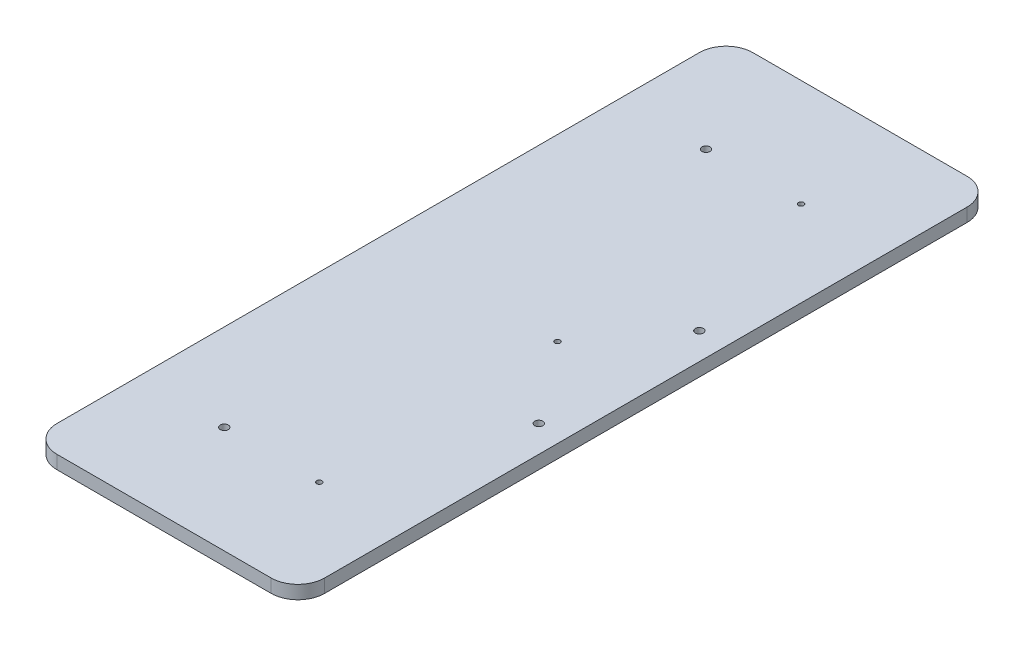
ISO-10303-21;
HEADER;
FILE_DESCRIPTION(('STEP AP214'),'2;1');
FILE_NAME('part.step','',(''),(''),'','','');
FILE_SCHEMA(('AUTOMOTIVE_DESIGN { 1 0 10303 214 1 1 1 1 }'));
ENDSEC;
DATA;
#1=APPLICATION_CONTEXT('core data for automotive mechanical design processes');
#2=APPLICATION_PROTOCOL_DEFINITION('international standard','automotive_design',2000,#1);
#3=PRODUCT_CONTEXT('',#1,'mechanical');
#4=PRODUCT('Part','Part','',(#3));
#5=PRODUCT_RELATED_PRODUCT_CATEGORY('part','',(#4));
#6=PRODUCT_DEFINITION_FORMATION('','',#4);
#7=PRODUCT_DEFINITION_CONTEXT('part definition',#1,'design');
#8=PRODUCT_DEFINITION('design','',#6,#7);
#9=PRODUCT_DEFINITION_SHAPE('','',#8);
#10=(LENGTH_UNIT() NAMED_UNIT(*) SI_UNIT(.MILLI.,.METRE.));
#11=(NAMED_UNIT(*) PLANE_ANGLE_UNIT() SI_UNIT($,.RADIAN.));
#12=(NAMED_UNIT(*) SI_UNIT($,.STERADIAN.) SOLID_ANGLE_UNIT());
#13=UNCERTAINTY_MEASURE_WITH_UNIT(LENGTH_MEASURE(1.E-05),#10,'distance_accuracy_value','');
#14=(GEOMETRIC_REPRESENTATION_CONTEXT(3) GLOBAL_UNCERTAINTY_ASSIGNED_CONTEXT((#13)) GLOBAL_UNIT_ASSIGNED_CONTEXT((#10,
#11,#12)) REPRESENTATION_CONTEXT('',''));
#15=CARTESIAN_POINT('',(0.,0.,0.));
#16=DIRECTION('',(0.,0.,1.));
#17=DIRECTION('',(1.,0.,0.));
#18=AXIS2_PLACEMENT_3D('',#15,#16,#17);
#19=CARTESIAN_POINT('',(0.,5.,0.));
#20=DIRECTION('',(0.,1.,0.));
#21=DIRECTION('',(0.,0.,1.));
#22=AXIS2_PLACEMENT_3D('',#19,#20,#21);
#23=PLANE('',#22);
#24=CARTESIAN_POINT('',(110.5,5.,-90.));
#25=DIRECTION('',(0.,1.,0.));
#26=DIRECTION('',(0.,0.,1.));
#27=AXIS2_PLACEMENT_3D('',#24,#25,#26);
#28=CIRCLE('',#27,0.999999999999998);
#29=CARTESIAN_POINT('',(110.5,5.,-89.));
#30=VERTEX_POINT('',#29);
#31=EDGE_CURVE('E195',#30,#30,#28,.T.);
#32=ORIENTED_EDGE('',*,*,#31,.F.);
#33=EDGE_LOOP('',(#32));
#34=FACE_BOUND('',#33,.T.);
#35=CARTESIAN_POINT('',(109.5,5.,0.));
#36=DIRECTION('',(0.,1.,0.));
#37=DIRECTION('',(0.,0.,1.));
#38=AXIS2_PLACEMENT_3D('',#35,#36,#37);
#39=CIRCLE('',#38,0.999999999999998);
#40=CARTESIAN_POINT('',(109.5,5.,0.999999999999998));
#41=VERTEX_POINT('',#40);
#42=EDGE_CURVE('E395',#41,#41,#39,.T.);
#43=ORIENTED_EDGE('',*,*,#42,.F.);
#44=EDGE_LOOP('',(#43));
#45=FACE_BOUND('',#44,.T.);
#46=CARTESIAN_POINT('',(110.5,5.,90.));
#47=DIRECTION('',(0.,1.,0.));
#48=DIRECTION('',(0.,0.,1.));
#49=AXIS2_PLACEMENT_3D('',#46,#47,#48);
#50=CIRCLE('',#49,1.00000000000001);
#51=CARTESIAN_POINT('',(110.5,5.,91.));
#52=VERTEX_POINT('',#51);
#53=EDGE_CURVE('E398',#52,#52,#50,.T.);
#54=ORIENTED_EDGE('',*,*,#53,.F.);
#55=EDGE_LOOP('',(#54));
#56=FACE_BOUND('',#55,.T.);
#57=CARTESIAN_POINT('',(75.,5.,-90.));
#58=DIRECTION('',(0.,1.,0.));
#59=DIRECTION('',(0.,0.,1.));
#60=AXIS2_PLACEMENT_3D('',#57,#58,#59);
#61=CIRCLE('',#60,1.50000000000001);
#62=CARTESIAN_POINT('',(75.,5.,-88.4999999999999));
#63=VERTEX_POINT('',#62);
#64=EDGE_CURVE('E188',#63,#63,#61,.T.);
#65=ORIENTED_EDGE('',*,*,#64,.F.);
#66=EDGE_LOOP('',(#65));
#67=FACE_BOUND('',#66,.T.);
#68=CARTESIAN_POINT('',(75.,5.,90.));
#69=DIRECTION('',(0.,1.,0.));
#70=DIRECTION('',(0.,0.,1.));
#71=AXIS2_PLACEMENT_3D('',#68,#69,#70);
#72=CIRCLE('',#71,1.50000000000001);
#73=CARTESIAN_POINT('',(75.,5.,91.5));
#74=VERTEX_POINT('',#73);
#75=EDGE_CURVE('E200',#74,#74,#72,.T.);
#76=ORIENTED_EDGE('',*,*,#75,.F.);
#77=EDGE_LOOP('',(#76));
#78=FACE_BOUND('',#77,.T.);
#79=CARTESIAN_POINT('',(132.5,5.,-30.));
#80=DIRECTION('',(0.,1.,0.));
#81=DIRECTION('',(0.,0.,1.));
#82=AXIS2_PLACEMENT_3D('',#79,#80,#81);
#83=CIRCLE('',#82,1.5);
#84=CARTESIAN_POINT('',(132.5,5.,-28.5));
#85=VERTEX_POINT('',#84);
#86=EDGE_CURVE('E181',#85,#85,#83,.T.);
#87=ORIENTED_EDGE('',*,*,#86,.F.);
#88=EDGE_LOOP('',(#87));
#89=FACE_BOUND('',#88,.T.);
#90=CARTESIAN_POINT('',(132.5,5.,30.));
#91=DIRECTION('',(0.,1.,0.));
#92=DIRECTION('',(0.,0.,1.));
#93=AXIS2_PLACEMENT_3D('',#90,#91,#92);
#94=CIRCLE('',#93,1.5);
#95=CARTESIAN_POINT('',(132.5,5.,31.5));
#96=VERTEX_POINT('',#95);
#97=EDGE_CURVE('E191',#96,#96,#94,.T.);
#98=ORIENTED_EDGE('',*,*,#97,.F.);
#99=EDGE_LOOP('',(#98));
#100=FACE_BOUND('',#99,.T.);
#101=DIRECTION('',(0.,0.,1.));
#102=VECTOR('',#101,1.);
#103=CARTESIAN_POINT('',(42.5,5.,-130.));
#104=LINE('',#103,#102);
#105=CARTESIAN_POINT('',(42.5,5.,-120.));
#106=VERTEX_POINT('',#105);
#107=CARTESIAN_POINT('',(42.5,5.,120.));
#108=VERTEX_POINT('',#107);
#109=EDGE_CURVE('E104',#106,#108,#104,.T.);
#110=ORIENTED_EDGE('',*,*,#109,.T.);
#111=CARTESIAN_POINT('',(52.5,5.,120.));
#112=DIRECTION('',(0.,1.,0.));
#113=DIRECTION('',(0.,0.,1.));
#114=AXIS2_PLACEMENT_3D('',#111,#112,#113);
#115=CIRCLE('',#114,10.);
#116=CARTESIAN_POINT('',(52.5,5.,130.));
#117=VERTEX_POINT('',#116);
#118=EDGE_CURVE('E138',#108,#117,#115,.T.);
#119=ORIENTED_EDGE('',*,*,#118,.T.);
#120=DIRECTION('',(1.,0.,0.));
#121=VECTOR('',#120,1.);
#122=CARTESIAN_POINT('',(50.,5.,130.));
#123=LINE('',#122,#121);
#124=CARTESIAN_POINT('',(132.5,5.,130.));
#125=VERTEX_POINT('',#124);
#126=EDGE_CURVE('E171',#117,#125,#123,.T.);
#127=ORIENTED_EDGE('',*,*,#126,.T.);
#128=CARTESIAN_POINT('',(132.5,5.,120.));
#129=DIRECTION('',(0.,1.,0.));
#130=DIRECTION('',(0.,0.,1.));
#131=AXIS2_PLACEMENT_3D('',#128,#129,#130);
#132=CIRCLE('',#131,10.);
#133=CARTESIAN_POINT('',(142.5,5.,120.));
#134=VERTEX_POINT('',#133);
#135=EDGE_CURVE('E136',#125,#134,#132,.T.);
#136=ORIENTED_EDGE('',*,*,#135,.T.);
#137=DIRECTION('',(0.,0.,1.));
#138=VECTOR('',#137,1.);
#139=CARTESIAN_POINT('',(142.5,5.,64.8471848090413));
#140=LINE('',#139,#138);
#141=CARTESIAN_POINT('',(142.5,5.,-120.));
#142=VERTEX_POINT('',#141);
#143=EDGE_CURVE('E166',#142,#134,#140,.T.);
#144=ORIENTED_EDGE('',*,*,#143,.F.);
#145=CARTESIAN_POINT('',(132.5,5.,-120.));
#146=DIRECTION('',(0.,1.,0.));
#147=DIRECTION('',(0.,0.,1.));
#148=AXIS2_PLACEMENT_3D('',#145,#146,#147);
#149=CIRCLE('',#148,10.);
#150=CARTESIAN_POINT('',(132.5,5.,-130.));
#151=VERTEX_POINT('',#150);
#152=EDGE_CURVE('E111',#142,#151,#149,.T.);
#153=ORIENTED_EDGE('',*,*,#152,.T.);
#154=DIRECTION('',(-1.,0.,0.));
#155=VECTOR('',#154,1.);
#156=CARTESIAN_POINT('',(49.9999999999999,5.,-130.));
#157=LINE('',#156,#155);
#158=CARTESIAN_POINT('',(52.5,5.,-130.));
#159=VERTEX_POINT('',#158);
#160=EDGE_CURVE('E106',#151,#159,#157,.T.);
#161=ORIENTED_EDGE('',*,*,#160,.T.);
#162=CARTESIAN_POINT('',(52.5,5.,-120.));
#163=DIRECTION('',(0.,1.,0.));
#164=DIRECTION('',(0.,0.,1.));
#165=AXIS2_PLACEMENT_3D('',#162,#163,#164);
#166=CIRCLE('',#165,10.);
#167=EDGE_CURVE('E102',#159,#106,#166,.T.);
#168=ORIENTED_EDGE('',*,*,#167,.T.);
#169=EDGE_LOOP('',(#110,#119,#127,#136,#144,#153,#161,#168));
#170=FACE_BOUND('',#169,.T.);
#171=ADVANCED_FACE('F35',(#34,#45,#56,#67,#78,#89,#100,#170),#23,.T.);
#172=CARTESIAN_POINT('',(0.,0.,0.));
#173=DIRECTION('',(0.,1.,0.));
#174=DIRECTION('',(0.,0.,1.));
#175=AXIS2_PLACEMENT_3D('',#172,#173,#174);
#176=PLANE('',#175);
#177=CARTESIAN_POINT('',(110.5,0.,-90.));
#178=DIRECTION('',(0.,1.,0.));
#179=DIRECTION('',(0.,0.,1.));
#180=AXIS2_PLACEMENT_3D('',#177,#178,#179);
#181=CIRCLE('',#180,0.999999999999998);
#182=CARTESIAN_POINT('',(110.5,0.,-89.));
#183=VERTEX_POINT('',#182);
#184=EDGE_CURVE('E132',#183,#183,#181,.T.);
#185=ORIENTED_EDGE('',*,*,#184,.T.);
#186=EDGE_LOOP('',(#185));
#187=FACE_BOUND('',#186,.T.);
#188=CARTESIAN_POINT('',(109.5,0.,0.));
#189=DIRECTION('',(0.,1.,0.));
#190=DIRECTION('',(0.,0.,1.));
#191=AXIS2_PLACEMENT_3D('',#188,#189,#190);
#192=CIRCLE('',#191,0.999999999999998);
#193=CARTESIAN_POINT('',(109.5,0.,0.999999999999998));
#194=VERTEX_POINT('',#193);
#195=EDGE_CURVE('E194',#194,#194,#192,.T.);
#196=ORIENTED_EDGE('',*,*,#195,.T.);
#197=EDGE_LOOP('',(#196));
#198=FACE_BOUND('',#197,.T.);
#199=CARTESIAN_POINT('',(110.5,0.,90.));
#200=DIRECTION('',(0.,1.,0.));
#201=DIRECTION('',(0.,0.,1.));
#202=AXIS2_PLACEMENT_3D('',#199,#200,#201);
#203=CIRCLE('',#202,1.00000000000001);
#204=CARTESIAN_POINT('',(110.5,0.,91.));
#205=VERTEX_POINT('',#204);
#206=EDGE_CURVE('E192',#205,#205,#203,.T.);
#207=ORIENTED_EDGE('',*,*,#206,.T.);
#208=EDGE_LOOP('',(#207));
#209=FACE_BOUND('',#208,.T.);
#210=CARTESIAN_POINT('',(75.,0.,-90.));
#211=DIRECTION('',(0.,1.,0.));
#212=DIRECTION('',(0.,0.,1.));
#213=AXIS2_PLACEMENT_3D('',#210,#211,#212);
#214=CIRCLE('',#213,1.50000000000001);
#215=CARTESIAN_POINT('',(75.,0.,-88.4999999999999));
#216=VERTEX_POINT('',#215);
#217=EDGE_CURVE('E187',#216,#216,#214,.T.);
#218=ORIENTED_EDGE('',*,*,#217,.T.);
#219=EDGE_LOOP('',(#218));
#220=FACE_BOUND('',#219,.T.);
#221=CARTESIAN_POINT('',(75.,0.,90.));
#222=DIRECTION('',(0.,1.,0.));
#223=DIRECTION('',(0.,0.,1.));
#224=AXIS2_PLACEMENT_3D('',#221,#222,#223);
#225=CIRCLE('',#224,1.50000000000001);
#226=CARTESIAN_POINT('',(75.,0.,91.5));
#227=VERTEX_POINT('',#226);
#228=EDGE_CURVE('E184',#227,#227,#225,.T.);
#229=ORIENTED_EDGE('',*,*,#228,.T.);
#230=EDGE_LOOP('',(#229));
#231=FACE_BOUND('',#230,.T.);
#232=CARTESIAN_POINT('',(132.5,0.,-30.));
#233=DIRECTION('',(0.,1.,0.));
#234=DIRECTION('',(0.,0.,1.));
#235=AXIS2_PLACEMENT_3D('',#232,#233,#234);
#236=CIRCLE('',#235,1.5);
#237=CARTESIAN_POINT('',(132.5,0.,-28.5));
#238=VERTEX_POINT('',#237);
#239=EDGE_CURVE('E122',#238,#238,#236,.T.);
#240=ORIENTED_EDGE('',*,*,#239,.T.);
#241=EDGE_LOOP('',(#240));
#242=FACE_BOUND('',#241,.T.);
#243=CARTESIAN_POINT('',(132.5,0.,30.));
#244=DIRECTION('',(0.,1.,0.));
#245=DIRECTION('',(0.,0.,1.));
#246=AXIS2_PLACEMENT_3D('',#243,#244,#245);
#247=CIRCLE('',#246,1.5);
#248=CARTESIAN_POINT('',(132.5,0.,31.5));
#249=VERTEX_POINT('',#248);
#250=EDGE_CURVE('E178',#249,#249,#247,.T.);
#251=ORIENTED_EDGE('',*,*,#250,.T.);
#252=EDGE_LOOP('',(#251));
#253=FACE_BOUND('',#252,.T.);
#254=DIRECTION('',(-1.,0.,0.));
#255=VECTOR('',#254,1.);
#256=CARTESIAN_POINT('',(50.,0.,130.));
#257=LINE('',#256,#255);
#258=CARTESIAN_POINT('',(132.5,0.,130.));
#259=VERTEX_POINT('',#258);
#260=CARTESIAN_POINT('',(52.5,0.,130.));
#261=VERTEX_POINT('',#260);
#262=EDGE_CURVE('E129',#259,#261,#257,.T.);
#263=ORIENTED_EDGE('',*,*,#262,.T.);
#264=CARTESIAN_POINT('',(52.5,0.,120.));
#265=DIRECTION('',(0.,1.,0.));
#266=DIRECTION('',(0.,0.,1.));
#267=AXIS2_PLACEMENT_3D('',#264,#265,#266);
#268=CIRCLE('',#267,10.);
#269=CARTESIAN_POINT('',(42.5,0.,120.));
#270=VERTEX_POINT('',#269);
#271=EDGE_CURVE('E147',#261,#270,#268,.F.);
#272=ORIENTED_EDGE('',*,*,#271,.T.);
#273=DIRECTION('',(0.,0.,1.));
#274=VECTOR('',#273,1.);
#275=CARTESIAN_POINT('',(42.5,0.,-130.));
#276=LINE('',#275,#274);
#277=CARTESIAN_POINT('',(42.5,0.,-120.));
#278=VERTEX_POINT('',#277);
#279=EDGE_CURVE('E121',#278,#270,#276,.T.);
#280=ORIENTED_EDGE('',*,*,#279,.F.);
#281=CARTESIAN_POINT('',(52.5,0.,-120.));
#282=DIRECTION('',(0.,1.,0.));
#283=DIRECTION('',(0.,0.,1.));
#284=AXIS2_PLACEMENT_3D('',#281,#282,#283);
#285=CIRCLE('',#284,10.);
#286=CARTESIAN_POINT('',(52.5,0.,-130.));
#287=VERTEX_POINT('',#286);
#288=EDGE_CURVE('E125',#278,#287,#285,.F.);
#289=ORIENTED_EDGE('',*,*,#288,.T.);
#290=DIRECTION('',(1.,0.,0.));
#291=VECTOR('',#290,1.);
#292=CARTESIAN_POINT('',(49.9999999999999,0.,-130.));
#293=LINE('',#292,#291);
#294=CARTESIAN_POINT('',(132.5,0.,-130.));
#295=VERTEX_POINT('',#294);
#296=EDGE_CURVE('E126',#287,#295,#293,.T.);
#297=ORIENTED_EDGE('',*,*,#296,.T.);
#298=CARTESIAN_POINT('',(132.5,0.,-120.));
#299=DIRECTION('',(0.,1.,0.));
#300=DIRECTION('',(0.,0.,1.));
#301=AXIS2_PLACEMENT_3D('',#298,#299,#300);
#302=CIRCLE('',#301,10.);
#303=CARTESIAN_POINT('',(142.5,0.,-120.));
#304=VERTEX_POINT('',#303);
#305=EDGE_CURVE('E58',#295,#304,#302,.F.);
#306=ORIENTED_EDGE('',*,*,#305,.T.);
#307=DIRECTION('',(0.,0.,1.));
#308=VECTOR('',#307,1.);
#309=CARTESIAN_POINT('',(142.5,0.,0.));
#310=LINE('',#309,#308);
#311=CARTESIAN_POINT('',(142.5,0.,120.));
#312=VERTEX_POINT('',#311);
#313=EDGE_CURVE('E167',#304,#312,#310,.T.);
#314=ORIENTED_EDGE('',*,*,#313,.T.);
#315=CARTESIAN_POINT('',(132.5,0.,120.));
#316=DIRECTION('',(0.,1.,0.));
#317=DIRECTION('',(0.,0.,1.));
#318=AXIS2_PLACEMENT_3D('',#315,#316,#317);
#319=CIRCLE('',#318,10.);
#320=EDGE_CURVE('E50',#312,#259,#319,.F.);
#321=ORIENTED_EDGE('',*,*,#320,.T.);
#322=EDGE_LOOP('',(#263,#272,#280,#289,#297,#306,#314,#321));
#323=FACE_BOUND('',#322,.T.);
#324=ADVANCED_FACE('F158',(#187,#198,#209,#220,#231,#242,#253,#323),#176,.F.);
#325=CARTESIAN_POINT('',(50.,-278.567765543682,130.));
#326=DIRECTION('',(0.,0.,1.));
#327=DIRECTION('',(1.,0.,0.));
#328=AXIS2_PLACEMENT_3D('',#325,#326,#327);
#329=PLANE('',#328);
#330=ORIENTED_EDGE('',*,*,#126,.F.);
#331=DIRECTION('',(0.,1.,0.));
#332=VECTOR('',#331,1.);
#333=CARTESIAN_POINT('',(52.5,-278.567765543682,130.));
#334=LINE('',#333,#332);
#335=EDGE_CURVE('E142',#117,#261,#334,.F.);
#336=ORIENTED_EDGE('',*,*,#335,.T.);
#337=ORIENTED_EDGE('',*,*,#262,.F.);
#338=DIRECTION('',(0.,-1.,0.));
#339=VECTOR('',#338,1.);
#340=CARTESIAN_POINT('',(132.5,5.,130.));
#341=LINE('',#340,#339);
#342=EDGE_CURVE('E140',#259,#125,#341,.F.);
#343=ORIENTED_EDGE('',*,*,#342,.T.);
#344=EDGE_LOOP('',(#330,#336,#337,#343));
#345=FACE_BOUND('',#344,.T.);
#346=ADVANCED_FACE('F226',(#345),#329,.T.);
#347=CARTESIAN_POINT('',(49.9999999999999,-278.567765543682,-130.));
#348=DIRECTION('',(0.,0.,-1.));
#349=DIRECTION('',(-1.,0.,0.));
#350=AXIS2_PLACEMENT_3D('',#347,#348,#349);
#351=PLANE('',#350);
#352=ORIENTED_EDGE('',*,*,#160,.F.);
#353=DIRECTION('',(0.,1.,0.));
#354=VECTOR('',#353,1.);
#355=CARTESIAN_POINT('',(132.5,0.,-130.));
#356=LINE('',#355,#354);
#357=EDGE_CURVE('E11',#151,#295,#356,.F.);
#358=ORIENTED_EDGE('',*,*,#357,.T.);
#359=ORIENTED_EDGE('',*,*,#296,.F.);
#360=DIRECTION('',(0.,1.,0.));
#361=VECTOR('',#360,1.);
#362=CARTESIAN_POINT('',(52.5,-278.567765543682,-130.));
#363=LINE('',#362,#361);
#364=EDGE_CURVE('E43',#287,#159,#363,.T.);
#365=ORIENTED_EDGE('',*,*,#364,.T.);
#366=EDGE_LOOP('',(#352,#358,#359,#365));
#367=FACE_BOUND('',#366,.T.);
#368=ADVANCED_FACE('F155',(#367),#351,.T.);
#369=CARTESIAN_POINT('',(142.5,-45.,64.8471848090413));
#370=DIRECTION('',(-1.,0.,0.));
#371=DIRECTION('',(0.,0.,1.));
#372=AXIS2_PLACEMENT_3D('',#369,#370,#371);
#373=PLANE('',#372);
#374=ORIENTED_EDGE('',*,*,#143,.T.);
#375=DIRECTION('',(0.,-1.,0.));
#376=VECTOR('',#375,1.);
#377=CARTESIAN_POINT('',(142.5,0.,120.));
#378=LINE('',#377,#376);
#379=EDGE_CURVE('E152',#134,#312,#378,.T.);
#380=ORIENTED_EDGE('',*,*,#379,.T.);
#381=ORIENTED_EDGE('',*,*,#313,.F.);
#382=DIRECTION('',(0.,1.,0.));
#383=VECTOR('',#382,1.);
#384=CARTESIAN_POINT('',(142.5,5.,-120.));
#385=LINE('',#384,#383);
#386=EDGE_CURVE('E149',#304,#142,#385,.T.);
#387=ORIENTED_EDGE('',*,*,#386,.T.);
#388=EDGE_LOOP('',(#374,#380,#381,#387));
#389=FACE_BOUND('',#388,.T.);
#390=ADVANCED_FACE('F165',(#389),#373,.F.);
#391=CARTESIAN_POINT('',(42.5,0.,-130.));
#392=DIRECTION('',(-1.,0.,0.));
#393=DIRECTION('',(0.,0.,1.));
#394=AXIS2_PLACEMENT_3D('',#391,#392,#393);
#395=PLANE('',#394);
#396=ORIENTED_EDGE('',*,*,#279,.T.);
#397=DIRECTION('',(0.,1.,0.));
#398=VECTOR('',#397,1.);
#399=CARTESIAN_POINT('',(42.5,0.,120.));
#400=LINE('',#399,#398);
#401=EDGE_CURVE('E112',#270,#108,#400,.T.);
#402=ORIENTED_EDGE('',*,*,#401,.T.);
#403=ORIENTED_EDGE('',*,*,#109,.F.);
#404=DIRECTION('',(0.,1.,0.));
#405=VECTOR('',#404,1.);
#406=CARTESIAN_POINT('',(42.5,0.,-120.));
#407=LINE('',#406,#405);
#408=EDGE_CURVE('E118',#106,#278,#407,.F.);
#409=ORIENTED_EDGE('',*,*,#408,.T.);
#410=EDGE_LOOP('',(#396,#402,#403,#409));
#411=FACE_BOUND('',#410,.T.);
#412=ADVANCED_FACE('F117',(#411),#395,.T.);
#413=CARTESIAN_POINT('',(132.5,-10.,30.));
#414=DIRECTION('',(0.,1.,0.));
#415=DIRECTION('',(0.,0.,1.));
#416=AXIS2_PLACEMENT_3D('',#413,#414,#415);
#417=CYLINDRICAL_SURFACE('',#416,1.5);
#418=ORIENTED_EDGE('',*,*,#97,.T.);
#419=EDGE_LOOP('',(#418));
#420=FACE_BOUND('',#419,.T.);
#421=ORIENTED_EDGE('',*,*,#250,.F.);
#422=EDGE_LOOP('',(#421));
#423=FACE_BOUND('',#422,.T.);
#424=ADVANCED_FACE('F216',(#420,#423),#417,.F.);
#425=CARTESIAN_POINT('',(132.5,-10.,-30.));
#426=DIRECTION('',(0.,1.,0.));
#427=DIRECTION('',(0.,0.,1.));
#428=AXIS2_PLACEMENT_3D('',#425,#426,#427);
#429=CYLINDRICAL_SURFACE('',#428,1.5);
#430=ORIENTED_EDGE('',*,*,#86,.T.);
#431=EDGE_LOOP('',(#430));
#432=FACE_BOUND('',#431,.T.);
#433=ORIENTED_EDGE('',*,*,#239,.F.);
#434=EDGE_LOOP('',(#433));
#435=FACE_BOUND('',#434,.T.);
#436=ADVANCED_FACE('F336',(#432,#435),#429,.F.);
#437=CARTESIAN_POINT('',(75.,-10.,90.));
#438=DIRECTION('',(0.,1.,0.));
#439=DIRECTION('',(0.,0.,1.));
#440=AXIS2_PLACEMENT_3D('',#437,#438,#439);
#441=CYLINDRICAL_SURFACE('',#440,1.50000000000001);
#442=ORIENTED_EDGE('',*,*,#75,.T.);
#443=EDGE_LOOP('',(#442));
#444=FACE_BOUND('',#443,.T.);
#445=ORIENTED_EDGE('',*,*,#228,.F.);
#446=EDGE_LOOP('',(#445));
#447=FACE_BOUND('',#446,.T.);
#448=ADVANCED_FACE('F344',(#444,#447),#441,.F.);
#449=CARTESIAN_POINT('',(75.,-10.,-90.));
#450=DIRECTION('',(0.,1.,0.));
#451=DIRECTION('',(0.,0.,1.));
#452=AXIS2_PLACEMENT_3D('',#449,#450,#451);
#453=CYLINDRICAL_SURFACE('',#452,1.50000000000001);
#454=ORIENTED_EDGE('',*,*,#64,.T.);
#455=EDGE_LOOP('',(#454));
#456=FACE_BOUND('',#455,.T.);
#457=ORIENTED_EDGE('',*,*,#217,.F.);
#458=EDGE_LOOP('',(#457));
#459=FACE_BOUND('',#458,.T.);
#460=ADVANCED_FACE('F353',(#456,#459),#453,.F.);
#461=CARTESIAN_POINT('',(110.5,-5.,90.));
#462=DIRECTION('',(0.,1.,0.));
#463=DIRECTION('',(0.,0.,1.));
#464=AXIS2_PLACEMENT_3D('',#461,#462,#463);
#465=CYLINDRICAL_SURFACE('',#464,1.00000000000001);
#466=ORIENTED_EDGE('',*,*,#53,.T.);
#467=EDGE_LOOP('',(#466));
#468=FACE_BOUND('',#467,.T.);
#469=ORIENTED_EDGE('',*,*,#206,.F.);
#470=EDGE_LOOP('',(#469));
#471=FACE_BOUND('',#470,.T.);
#472=ADVANCED_FACE('F361',(#468,#471),#465,.F.);
#473=CARTESIAN_POINT('',(109.5,-5.,0.));
#474=DIRECTION('',(0.,1.,0.));
#475=DIRECTION('',(0.,0.,1.));
#476=AXIS2_PLACEMENT_3D('',#473,#474,#475);
#477=CYLINDRICAL_SURFACE('',#476,0.999999999999998);
#478=ORIENTED_EDGE('',*,*,#42,.T.);
#479=EDGE_LOOP('',(#478));
#480=FACE_BOUND('',#479,.T.);
#481=ORIENTED_EDGE('',*,*,#195,.F.);
#482=EDGE_LOOP('',(#481));
#483=FACE_BOUND('',#482,.T.);
#484=ADVANCED_FACE('F370',(#480,#483),#477,.F.);
#485=CARTESIAN_POINT('',(110.5,-5.,-90.));
#486=DIRECTION('',(0.,1.,0.));
#487=DIRECTION('',(0.,0.,1.));
#488=AXIS2_PLACEMENT_3D('',#485,#486,#487);
#489=CYLINDRICAL_SURFACE('',#488,0.999999999999998);
#490=ORIENTED_EDGE('',*,*,#31,.T.);
#491=EDGE_LOOP('',(#490));
#492=FACE_BOUND('',#491,.T.);
#493=ORIENTED_EDGE('',*,*,#184,.F.);
#494=EDGE_LOOP('',(#493));
#495=FACE_BOUND('',#494,.T.);
#496=ADVANCED_FACE('F237',(#492,#495),#489,.F.);
#497=CARTESIAN_POINT('',(52.5,0.,120.));
#498=DIRECTION('',(0.,1.,0.));
#499=DIRECTION('',(0.,0.,1.));
#500=AXIS2_PLACEMENT_3D('',#497,#498,#499);
#501=CYLINDRICAL_SURFACE('',#500,10.);
#502=ORIENTED_EDGE('',*,*,#271,.F.);
#503=ORIENTED_EDGE('',*,*,#335,.F.);
#504=ORIENTED_EDGE('',*,*,#118,.F.);
#505=ORIENTED_EDGE('',*,*,#401,.F.);
#506=EDGE_LOOP('',(#502,#503,#504,#505));
#507=FACE_BOUND('',#506,.T.);
#508=ADVANCED_FACE('F233',(#507),#501,.T.);
#509=CARTESIAN_POINT('',(132.5,-45.,120.));
#510=DIRECTION('',(0.,1.,0.));
#511=DIRECTION('',(0.,0.,1.));
#512=AXIS2_PLACEMENT_3D('',#509,#510,#511);
#513=CYLINDRICAL_SURFACE('',#512,10.);
#514=ORIENTED_EDGE('',*,*,#135,.F.);
#515=ORIENTED_EDGE('',*,*,#342,.F.);
#516=ORIENTED_EDGE('',*,*,#320,.F.);
#517=ORIENTED_EDGE('',*,*,#379,.F.);
#518=EDGE_LOOP('',(#514,#515,#516,#517));
#519=FACE_BOUND('',#518,.T.);
#520=ADVANCED_FACE('F236',(#519),#513,.T.);
#521=CARTESIAN_POINT('',(132.5,-45.,-120.));
#522=DIRECTION('',(0.,-1.,0.));
#523=DIRECTION('',(0.,0.,-1.));
#524=AXIS2_PLACEMENT_3D('',#521,#522,#523);
#525=CYLINDRICAL_SURFACE('',#524,10.);
#526=ORIENTED_EDGE('',*,*,#305,.F.);
#527=ORIENTED_EDGE('',*,*,#357,.F.);
#528=ORIENTED_EDGE('',*,*,#152,.F.);
#529=ORIENTED_EDGE('',*,*,#386,.F.);
#530=EDGE_LOOP('',(#526,#527,#528,#529));
#531=FACE_BOUND('',#530,.T.);
#532=ADVANCED_FACE('F161',(#531),#525,.T.);
#533=CARTESIAN_POINT('',(52.5,-278.567765543682,-120.));
#534=DIRECTION('',(0.,1.,0.));
#535=DIRECTION('',(0.,0.,1.));
#536=AXIS2_PLACEMENT_3D('',#533,#534,#535);
#537=CYLINDRICAL_SURFACE('',#536,10.);
#538=ORIENTED_EDGE('',*,*,#288,.F.);
#539=ORIENTED_EDGE('',*,*,#408,.F.);
#540=ORIENTED_EDGE('',*,*,#167,.F.);
#541=ORIENTED_EDGE('',*,*,#364,.F.);
#542=EDGE_LOOP('',(#538,#539,#540,#541));
#543=FACE_BOUND('',#542,.T.);
#544=ADVANCED_FACE('F37',(#543),#537,.T.);
#545=CLOSED_SHELL('',(#171,#324,#346,#368,#390,#412,#424,#436,#448,#460,#472,#484,#496,#508,
#520,#532,#544));
#546=MANIFOLD_SOLID_BREP('B2',#545);
#547=ADVANCED_BREP_SHAPE_REPRESENTATION('',(#18,#546),#14);
#548=SHAPE_DEFINITION_REPRESENTATION(#9,#547);
ENDSEC;
END-ISO-10303-21;
